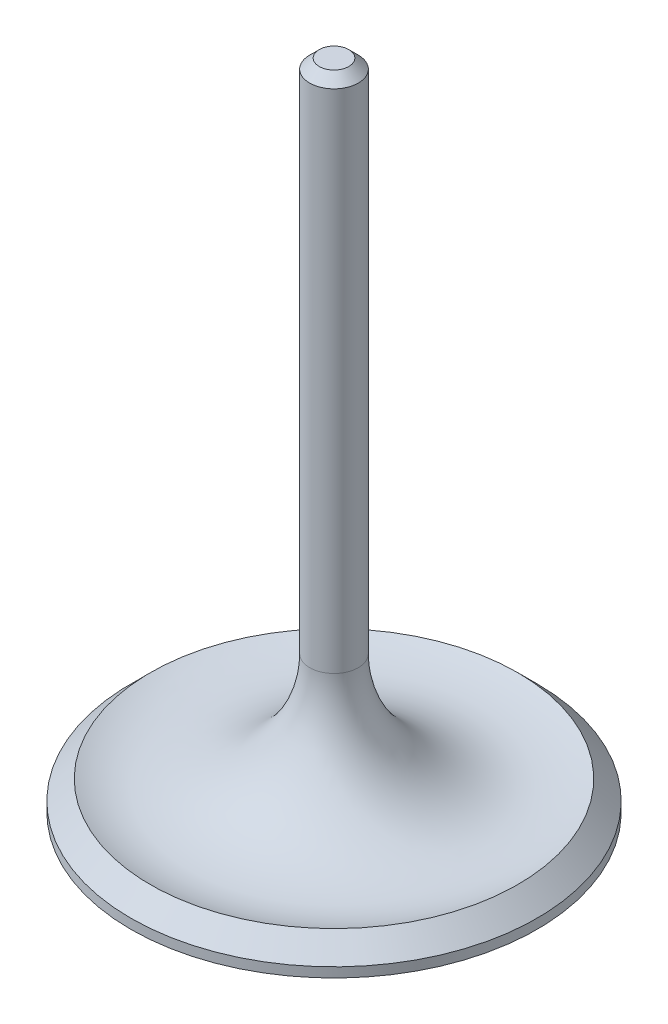
ISO-10303-21;
HEADER;
FILE_DESCRIPTION(('STEP AP214'),'2;1');
FILE_NAME('part.step','',(''),(''),'','','');
FILE_SCHEMA(('AUTOMOTIVE_DESIGN { 1 0 10303 214 1 1 1 1 }'));
ENDSEC;
DATA;
#1=APPLICATION_CONTEXT('core data for automotive mechanical design processes');
#2=APPLICATION_PROTOCOL_DEFINITION('international standard','automotive_design',2000,#1);
#3=PRODUCT_CONTEXT('',#1,'mechanical');
#4=PRODUCT('Part','Part','',(#3));
#5=PRODUCT_RELATED_PRODUCT_CATEGORY('part','',(#4));
#6=PRODUCT_DEFINITION_FORMATION('','',#4);
#7=PRODUCT_DEFINITION_CONTEXT('part definition',#1,'design');
#8=PRODUCT_DEFINITION('design','',#6,#7);
#9=PRODUCT_DEFINITION_SHAPE('','',#8);
#10=(LENGTH_UNIT() NAMED_UNIT(*) SI_UNIT(.MILLI.,.METRE.));
#11=(NAMED_UNIT(*) PLANE_ANGLE_UNIT() SI_UNIT($,.RADIAN.));
#12=(NAMED_UNIT(*) SI_UNIT($,.STERADIAN.) SOLID_ANGLE_UNIT());
#13=UNCERTAINTY_MEASURE_WITH_UNIT(LENGTH_MEASURE(1.E-05),#10,'distance_accuracy_value','');
#14=(GEOMETRIC_REPRESENTATION_CONTEXT(3) GLOBAL_UNCERTAINTY_ASSIGNED_CONTEXT((#13)) GLOBAL_UNIT_ASSIGNED_CONTEXT((#10,
#11,#12)) REPRESENTATION_CONTEXT('',''));
#15=CARTESIAN_POINT('',(0.,0.,0.));
#16=DIRECTION('',(0.,0.,1.));
#17=DIRECTION('',(1.,0.,0.));
#18=AXIS2_PLACEMENT_3D('',#15,#16,#17);
#19=CARTESIAN_POINT('',(0.,85.55,0.));
#20=DIRECTION('',(0.,1.,0.));
#21=DIRECTION('',(0.,0.,1.));
#22=AXIS2_PLACEMENT_3D('',#19,#20,#21);
#23=PLANE('',#22);
#24=CARTESIAN_POINT('',(0.,85.55,0.));
#25=DIRECTION('',(0.,1.,0.));
#26=DIRECTION('',(0.,0.,1.));
#27=AXIS2_PLACEMENT_3D('',#24,#25,#26);
#28=CIRCLE('',#27,1.92999999999999);
#29=CARTESIAN_POINT('',(0.,85.55,1.92999999999999));
#30=VERTEX_POINT('',#29);
#31=EDGE_CURVE('E10',#30,#30,#28,.T.);
#32=ORIENTED_EDGE('',*,*,#31,.T.);
#33=EDGE_LOOP('',(#32));
#34=FACE_BOUND('',#33,.T.);
#35=ADVANCED_FACE('F32',(#34),#23,.T.);
#36=CARTESIAN_POINT('',(0.,0.,0.));
#37=DIRECTION('',(0.,-1.,0.));
#38=DIRECTION('',(0.,0.,-1.));
#39=AXIS2_PLACEMENT_3D('',#36,#37,#38);
#40=CYLINDRICAL_SURFACE('',#39,3.18);
#41=CARTESIAN_POINT('',(0.,84.3,0.));
#42=DIRECTION('',(0.,1.,0.));
#43=DIRECTION('',(0.,0.,1.));
#44=AXIS2_PLACEMENT_3D('',#41,#42,#43);
#45=CIRCLE('',#44,3.18);
#46=CARTESIAN_POINT('',(0.,84.3,3.18));
#47=VERTEX_POINT('',#46);
#48=EDGE_CURVE('E40',#47,#47,#45,.F.);
#49=ORIENTED_EDGE('',*,*,#48,.T.);
#50=EDGE_LOOP('',(#49));
#51=FACE_BOUND('',#50,.T.);
#52=CARTESIAN_POINT('',(0.,17.982706163609,0.));
#53=DIRECTION('',(0.,-1.,0.));
#54=DIRECTION('',(0.,0.,-1.));
#55=AXIS2_PLACEMENT_3D('',#52,#53,#54);
#56=CIRCLE('',#55,3.18);
#57=CARTESIAN_POINT('',(0.,17.982706163609,-3.18));
#58=VERTEX_POINT('',#57);
#59=EDGE_CURVE('E44',#58,#58,#56,.T.);
#60=ORIENTED_EDGE('',*,*,#59,.F.);
#61=EDGE_LOOP('',(#60));
#62=FACE_BOUND('',#61,.T.);
#63=ADVANCED_FACE('F76',(#51,#62),#40,.T.);
#64=CARTESIAN_POINT('',(0.,17.982706163609,0.));
#65=DIRECTION('',(0.,-1.,0.));
#66=DIRECTION('',(0.,0.,-1.));
#67=AXIS2_PLACEMENT_3D('',#64,#65,#66);
#68=TOROIDAL_SURFACE('',#67,18.43,15.25);
#69=ORIENTED_EDGE('',*,*,#59,.T.);
#70=EDGE_LOOP('',(#69));
#71=FACE_BOUND('',#70,.T.);
#72=CARTESIAN_POINT('',(0.,3.81,0.));
#73=DIRECTION('',(0.,-1.,0.));
#74=DIRECTION('',(0.,0.,-1.));
#75=AXIS2_PLACEMENT_3D('',#72,#73,#74);
#76=CIRCLE('',#75,24.06);
#77=CARTESIAN_POINT('',(0.,3.81,-24.06));
#78=VERTEX_POINT('',#77);
#79=EDGE_CURVE('E48',#78,#78,#76,.T.);
#80=ORIENTED_EDGE('',*,*,#79,.F.);
#81=EDGE_LOOP('',(#80));
#82=FACE_BOUND('',#81,.T.);
#83=ADVANCED_FACE('F72',(#71,#82),#68,.F.);
#84=CARTESIAN_POINT('',(0.,1.27,0.));
#85=DIRECTION('',(0.,-1.,0.));
#86=DIRECTION('',(0.,0.,-1.));
#87=AXIS2_PLACEMENT_3D('',#84,#85,#86);
#88=CONICAL_SURFACE('',#87,26.6,0.785398163397454);
#89=ORIENTED_EDGE('',*,*,#79,.T.);
#90=EDGE_LOOP('',(#89));
#91=FACE_BOUND('',#90,.T.);
#92=CARTESIAN_POINT('',(0.,1.27,0.));
#93=DIRECTION('',(0.,-1.,0.));
#94=DIRECTION('',(0.,0.,-1.));
#95=AXIS2_PLACEMENT_3D('',#92,#93,#94);
#96=CIRCLE('',#95,26.6);
#97=CARTESIAN_POINT('',(0.,1.27,-26.6));
#98=VERTEX_POINT('',#97);
#99=EDGE_CURVE('E53',#98,#98,#96,.T.);
#100=ORIENTED_EDGE('',*,*,#99,.F.);
#101=EDGE_LOOP('',(#100));
#102=FACE_BOUND('',#101,.T.);
#103=ADVANCED_FACE('F64',(#91,#102),#88,.T.);
#104=CARTESIAN_POINT('',(0.,0.,0.));
#105=DIRECTION('',(0.,-1.,0.));
#106=DIRECTION('',(0.,0.,-1.));
#107=AXIS2_PLACEMENT_3D('',#104,#105,#106);
#108=CYLINDRICAL_SURFACE('',#107,26.6);
#109=ORIENTED_EDGE('',*,*,#99,.T.);
#110=EDGE_LOOP('',(#109));
#111=FACE_BOUND('',#110,.T.);
#112=CARTESIAN_POINT('',(0.,0.,0.));
#113=DIRECTION('',(0.,-1.,0.));
#114=DIRECTION('',(0.,0.,-1.));
#115=AXIS2_PLACEMENT_3D('',#112,#113,#114);
#116=CIRCLE('',#115,26.6);
#117=CARTESIAN_POINT('',(0.,0.,-26.6));
#118=VERTEX_POINT('',#117);
#119=EDGE_CURVE('E56',#118,#118,#116,.T.);
#120=ORIENTED_EDGE('',*,*,#119,.F.);
#121=EDGE_LOOP('',(#120));
#122=FACE_BOUND('',#121,.T.);
#123=ADVANCED_FACE('F62',(#111,#122),#108,.T.);
#124=CARTESIAN_POINT('',(0.,0.,0.));
#125=DIRECTION('',(0.,-1.,0.));
#126=DIRECTION('',(0.,0.,-1.));
#127=AXIS2_PLACEMENT_3D('',#124,#125,#126);
#128=PLANE('',#127);
#129=ORIENTED_EDGE('',*,*,#119,.T.);
#130=EDGE_LOOP('',(#129));
#131=FACE_BOUND('',#130,.T.);
#132=ADVANCED_FACE('F60',(#131),#128,.T.);
#133=CARTESIAN_POINT('',(0.,84.3,0.));
#134=DIRECTION('',(0.,-1.,0.));
#135=DIRECTION('',(0.,0.,-1.));
#136=AXIS2_PLACEMENT_3D('',#133,#134,#135);
#137=CONICAL_SURFACE('',#136,3.18,0.785398163397442);
#138=ORIENTED_EDGE('',*,*,#31,.F.);
#139=EDGE_LOOP('',(#138));
#140=FACE_BOUND('',#139,.T.);
#141=ORIENTED_EDGE('',*,*,#48,.F.);
#142=EDGE_LOOP('',(#141));
#143=FACE_BOUND('',#142,.T.);
#144=ADVANCED_FACE('F35',(#140,#143),#137,.T.);
#145=CLOSED_SHELL('',(#35,#63,#83,#103,#123,#132,#144));
#146=MANIFOLD_SOLID_BREP('B2',#145);
#147=ADVANCED_BREP_SHAPE_REPRESENTATION('',(#18,#146),#14);
#148=SHAPE_DEFINITION_REPRESENTATION(#9,#147);
ENDSEC;
END-ISO-10303-21;
